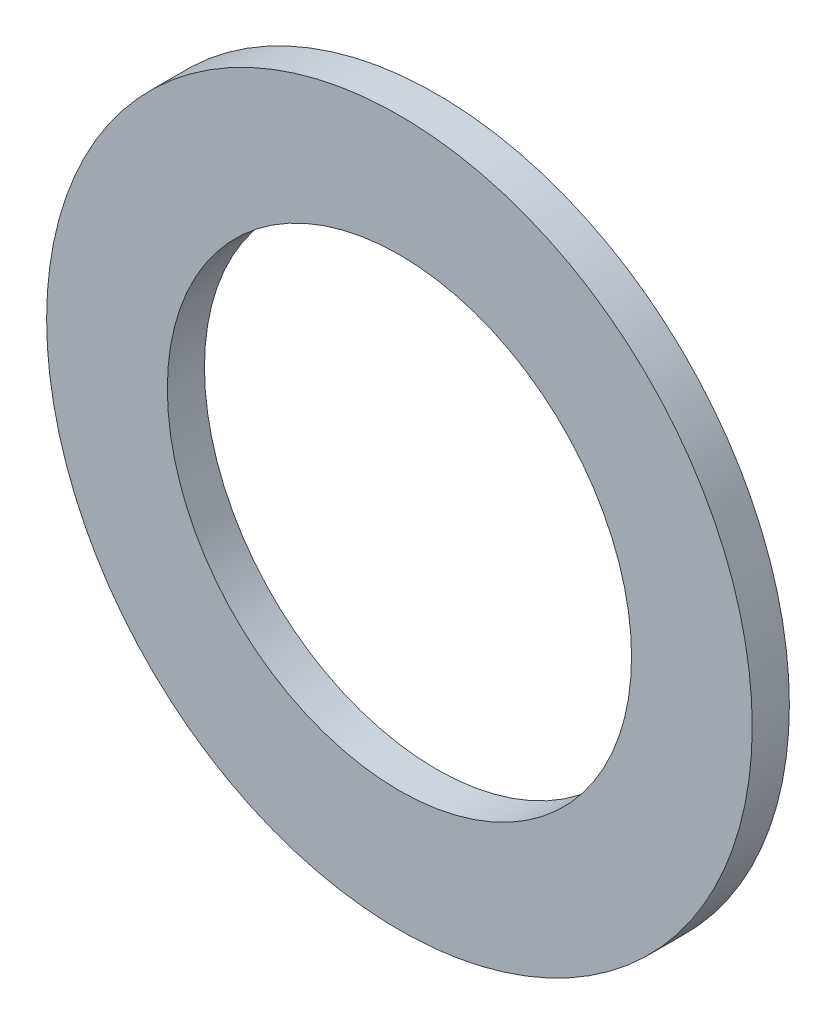
ISO-10303-21;
HEADER;
FILE_DESCRIPTION(('STEP AP214'),'2;1');
FILE_NAME('part.step','',(''),(''),'','','');
FILE_SCHEMA(('AUTOMOTIVE_DESIGN { 1 0 10303 214 1 1 1 1 }'));
ENDSEC;
DATA;
#1=APPLICATION_CONTEXT('core data for automotive mechanical design processes');
#2=APPLICATION_PROTOCOL_DEFINITION('international standard','automotive_design',2000,#1);
#3=PRODUCT_CONTEXT('',#1,'mechanical');
#4=PRODUCT('Part','Part','',(#3));
#5=PRODUCT_RELATED_PRODUCT_CATEGORY('part','',(#4));
#6=PRODUCT_DEFINITION_FORMATION('','',#4);
#7=PRODUCT_DEFINITION_CONTEXT('part definition',#1,'design');
#8=PRODUCT_DEFINITION('design','',#6,#7);
#9=PRODUCT_DEFINITION_SHAPE('','',#8);
#10=(LENGTH_UNIT() NAMED_UNIT(*) SI_UNIT(.MILLI.,.METRE.));
#11=(NAMED_UNIT(*) PLANE_ANGLE_UNIT() SI_UNIT($,.RADIAN.));
#12=(NAMED_UNIT(*) SI_UNIT($,.STERADIAN.) SOLID_ANGLE_UNIT());
#13=UNCERTAINTY_MEASURE_WITH_UNIT(LENGTH_MEASURE(1.E-05),#10,'distance_accuracy_value','');
#14=(GEOMETRIC_REPRESENTATION_CONTEXT(3) GLOBAL_UNCERTAINTY_ASSIGNED_CONTEXT((#13)) GLOBAL_UNIT_ASSIGNED_CONTEXT((#10,
#11,#12)) REPRESENTATION_CONTEXT('',''));
#15=CARTESIAN_POINT('',(0.,0.,0.));
#16=DIRECTION('',(0.,0.,1.));
#17=DIRECTION('',(1.,0.,0.));
#18=AXIS2_PLACEMENT_3D('',#15,#16,#17);
#19=CARTESIAN_POINT('',(0.,0.,-0.508));
#20=DIRECTION('',(0.,0.,1.));
#21=DIRECTION('',(1.,0.,0.));
#22=AXIS2_PLACEMENT_3D('',#19,#20,#21);
#23=CYLINDRICAL_SURFACE('',#22,4.826);
#24=CARTESIAN_POINT('',(0.,0.,-0.508));
#25=DIRECTION('',(0.,0.,1.));
#26=DIRECTION('',(1.,0.,0.));
#27=AXIS2_PLACEMENT_3D('',#24,#25,#26);
#28=CIRCLE('',#27,4.826);
#29=CARTESIAN_POINT('',(4.826,0.,-0.508));
#30=VERTEX_POINT('',#29);
#31=EDGE_CURVE('E10',#30,#30,#28,.T.);
#32=ORIENTED_EDGE('',*,*,#31,.T.);
#33=EDGE_LOOP('',(#32));
#34=FACE_BOUND('',#33,.T.);
#35=CARTESIAN_POINT('',(0.,0.,0.));
#36=DIRECTION('',(0.,0.,1.));
#37=DIRECTION('',(1.,0.,0.));
#38=AXIS2_PLACEMENT_3D('',#35,#36,#37);
#39=CIRCLE('',#38,4.826);
#40=CARTESIAN_POINT('',(4.826,0.,0.));
#41=VERTEX_POINT('',#40);
#42=EDGE_CURVE('E35',#41,#41,#39,.T.);
#43=ORIENTED_EDGE('',*,*,#42,.F.);
#44=EDGE_LOOP('',(#43));
#45=FACE_BOUND('',#44,.T.);
#46=ADVANCED_FACE('F32',(#34,#45),#23,.T.);
#47=CARTESIAN_POINT('',(0.,0.,-0.508));
#48=DIRECTION('',(0.,0.,1.));
#49=DIRECTION('',(1.,0.,0.));
#50=AXIS2_PLACEMENT_3D('',#47,#48,#49);
#51=PLANE('',#50);
#52=CARTESIAN_POINT('',(0.,0.,-0.508));
#53=DIRECTION('',(0.,0.,1.));
#54=DIRECTION('',(1.,0.,0.));
#55=AXIS2_PLACEMENT_3D('',#52,#53,#54);
#56=CIRCLE('',#55,3.175);
#57=CARTESIAN_POINT('',(3.175,0.,-0.508));
#58=VERTEX_POINT('',#57);
#59=EDGE_CURVE('E42',#58,#58,#56,.T.);
#60=ORIENTED_EDGE('',*,*,#59,.T.);
#61=EDGE_LOOP('',(#60));
#62=FACE_BOUND('',#61,.T.);
#63=ORIENTED_EDGE('',*,*,#31,.F.);
#64=EDGE_LOOP('',(#63));
#65=FACE_BOUND('',#64,.T.);
#66=ADVANCED_FACE('F50',(#62,#65),#51,.F.);
#67=CARTESIAN_POINT('',(0.,0.,0.));
#68=DIRECTION('',(0.,0.,1.));
#69=DIRECTION('',(1.,0.,0.));
#70=AXIS2_PLACEMENT_3D('',#67,#68,#69);
#71=PLANE('',#70);
#72=CARTESIAN_POINT('',(0.,0.,0.));
#73=DIRECTION('',(0.,0.,1.));
#74=DIRECTION('',(1.,0.,0.));
#75=AXIS2_PLACEMENT_3D('',#72,#73,#74);
#76=CIRCLE('',#75,3.175);
#77=CARTESIAN_POINT('',(3.175,0.,0.));
#78=VERTEX_POINT('',#77);
#79=EDGE_CURVE('E44',#78,#78,#76,.T.);
#80=ORIENTED_EDGE('',*,*,#79,.F.);
#81=EDGE_LOOP('',(#80));
#82=FACE_BOUND('',#81,.T.);
#83=ORIENTED_EDGE('',*,*,#42,.T.);
#84=EDGE_LOOP('',(#83));
#85=FACE_BOUND('',#84,.T.);
#86=ADVANCED_FACE('F56',(#82,#85),#71,.T.);
#87=CARTESIAN_POINT('',(0.,0.,-0.508));
#88=DIRECTION('',(0.,0.,1.));
#89=DIRECTION('',(1.,0.,0.));
#90=AXIS2_PLACEMENT_3D('',#87,#88,#89);
#91=CYLINDRICAL_SURFACE('',#90,3.175);
#92=ORIENTED_EDGE('',*,*,#59,.F.);
#93=EDGE_LOOP('',(#92));
#94=FACE_BOUND('',#93,.T.);
#95=ORIENTED_EDGE('',*,*,#79,.T.);
#96=EDGE_LOOP('',(#95));
#97=FACE_BOUND('',#96,.T.);
#98=ADVANCED_FACE('F53',(#94,#97),#91,.F.);
#99=CLOSED_SHELL('',(#46,#66,#86,#98));
#100=MANIFOLD_SOLID_BREP('B2',#99);
#101=ADVANCED_BREP_SHAPE_REPRESENTATION('',(#18,#100),#14);
#102=SHAPE_DEFINITION_REPRESENTATION(#9,#101);
ENDSEC;
END-ISO-10303-21;
